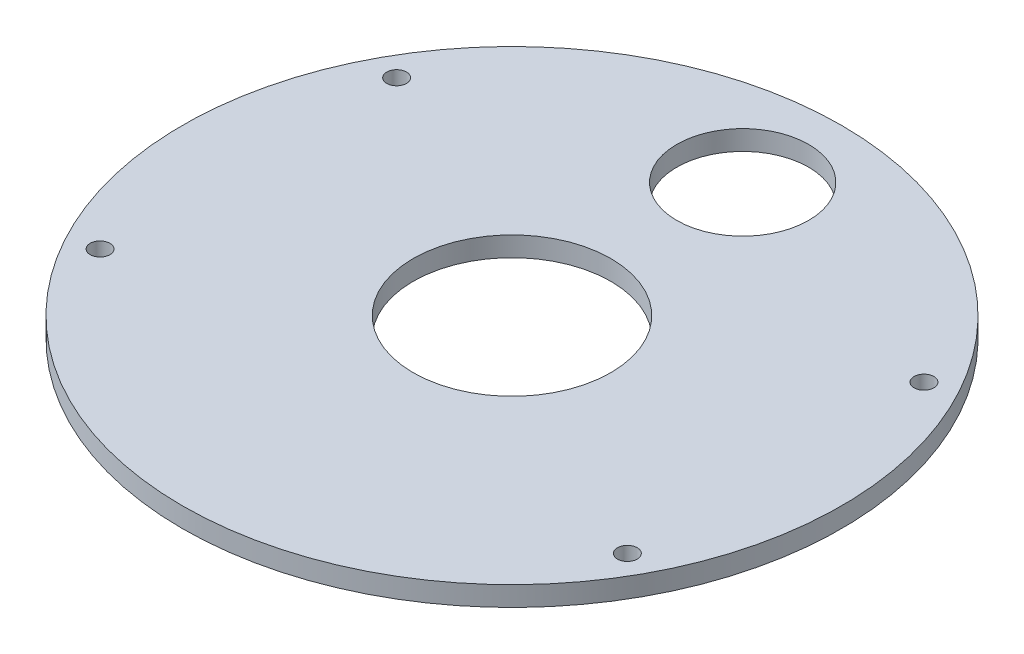
ISO-10303-21;
HEADER;
FILE_DESCRIPTION(('STEP AP214'),'2;1');
FILE_NAME('part.step','',(''),(''),'','','');
FILE_SCHEMA(('AUTOMOTIVE_DESIGN { 1 0 10303 214 1 1 1 1 }'));
ENDSEC;
DATA;
#1=APPLICATION_CONTEXT('core data for automotive mechanical design processes');
#2=APPLICATION_PROTOCOL_DEFINITION('international standard','automotive_design',2000,#1);
#3=PRODUCT_CONTEXT('',#1,'mechanical');
#4=PRODUCT('Part','Part','',(#3));
#5=PRODUCT_RELATED_PRODUCT_CATEGORY('part','',(#4));
#6=PRODUCT_DEFINITION_FORMATION('','',#4);
#7=PRODUCT_DEFINITION_CONTEXT('part definition',#1,'design');
#8=PRODUCT_DEFINITION('design','',#6,#7);
#9=PRODUCT_DEFINITION_SHAPE('','',#8);
#10=(LENGTH_UNIT() NAMED_UNIT(*) SI_UNIT(.MILLI.,.METRE.));
#11=(NAMED_UNIT(*) PLANE_ANGLE_UNIT() SI_UNIT($,.RADIAN.));
#12=(NAMED_UNIT(*) SI_UNIT($,.STERADIAN.) SOLID_ANGLE_UNIT());
#13=UNCERTAINTY_MEASURE_WITH_UNIT(LENGTH_MEASURE(1.E-05),#10,'distance_accuracy_value','');
#14=(GEOMETRIC_REPRESENTATION_CONTEXT(3) GLOBAL_UNCERTAINTY_ASSIGNED_CONTEXT((#13)) GLOBAL_UNIT_ASSIGNED_CONTEXT((#10,
#11,#12)) REPRESENTATION_CONTEXT('',''));
#15=CARTESIAN_POINT('',(0.,0.,0.));
#16=DIRECTION('',(0.,0.,1.));
#17=DIRECTION('',(1.,0.,0.));
#18=AXIS2_PLACEMENT_3D('',#15,#16,#17);
#19=CARTESIAN_POINT('',(0.,3.,0.));
#20=DIRECTION('',(0.,1.,0.));
#21=DIRECTION('',(0.,0.,1.));
#22=AXIS2_PLACEMENT_3D('',#19,#20,#21);
#23=PLANE('',#22);
#24=CARTESIAN_POINT('',(0.,3.,-35.));
#25=DIRECTION('',(0.,1.,0.));
#26=DIRECTION('',(0.,0.,1.));
#27=AXIS2_PLACEMENT_3D('',#24,#25,#26);
#28=CIRCLE('',#27,10.);
#29=CARTESIAN_POINT('',(0.,3.,-25.));
#30=VERTEX_POINT('',#29);
#31=EDGE_CURVE('E76',#30,#30,#28,.T.);
#32=ORIENTED_EDGE('',*,*,#31,.F.);
#33=EDGE_LOOP('',(#32));
#34=FACE_BOUND('',#33,.T.);
#35=CARTESIAN_POINT('',(0.,3.,0.));
#36=DIRECTION('',(0.,1.,0.));
#37=DIRECTION('',(0.,0.,1.));
#38=AXIS2_PLACEMENT_3D('',#35,#36,#37);
#39=CIRCLE('',#38,15.);
#40=CARTESIAN_POINT('',(0.,3.,15.));
#41=VERTEX_POINT('',#40);
#42=EDGE_CURVE('E73',#41,#41,#39,.T.);
#43=ORIENTED_EDGE('',*,*,#42,.F.);
#44=EDGE_LOOP('',(#43));
#45=FACE_BOUND('',#44,.T.);
#46=CARTESIAN_POINT('',(40.,3.,22.5));
#47=DIRECTION('',(0.,1.,0.));
#48=DIRECTION('',(0.,0.,1.));
#49=AXIS2_PLACEMENT_3D('',#46,#47,#48);
#50=CIRCLE('',#49,1.5);
#51=CARTESIAN_POINT('',(40.,3.,24.));
#52=VERTEX_POINT('',#51);
#53=EDGE_CURVE('E59',#52,#52,#50,.T.);
#54=ORIENTED_EDGE('',*,*,#53,.F.);
#55=EDGE_LOOP('',(#54));
#56=FACE_BOUND('',#55,.T.);
#57=CARTESIAN_POINT('',(-40.,3.,-22.5));
#58=DIRECTION('',(0.,1.,0.));
#59=DIRECTION('',(0.,0.,1.));
#60=AXIS2_PLACEMENT_3D('',#57,#58,#59);
#61=CIRCLE('',#60,1.5);
#62=CARTESIAN_POINT('',(-40.,3.,-21.));
#63=VERTEX_POINT('',#62);
#64=EDGE_CURVE('E48',#63,#63,#61,.T.);
#65=ORIENTED_EDGE('',*,*,#64,.F.);
#66=EDGE_LOOP('',(#65));
#67=FACE_BOUND('',#66,.T.);
#68=CARTESIAN_POINT('',(0.,3.,0.));
#69=DIRECTION('',(0.,1.,0.));
#70=DIRECTION('',(0.,0.,1.));
#71=AXIS2_PLACEMENT_3D('',#68,#69,#70);
#72=CIRCLE('',#71,50.);
#73=CARTESIAN_POINT('',(0.,3.,50.));
#74=VERTEX_POINT('',#73);
#75=EDGE_CURVE('E10',#74,#74,#72,.T.);
#76=ORIENTED_EDGE('',*,*,#75,.T.);
#77=EDGE_LOOP('',(#76));
#78=FACE_BOUND('',#77,.T.);
#79=CARTESIAN_POINT('',(40.,3.,-22.5));
#80=DIRECTION('',(0.,1.,0.));
#81=DIRECTION('',(0.,0.,1.));
#82=AXIS2_PLACEMENT_3D('',#79,#80,#81);
#83=CIRCLE('',#82,1.5);
#84=CARTESIAN_POINT('',(40.,3.,-21.));
#85=VERTEX_POINT('',#84);
#86=EDGE_CURVE('E53',#85,#85,#83,.T.);
#87=ORIENTED_EDGE('',*,*,#86,.F.);
#88=EDGE_LOOP('',(#87));
#89=FACE_BOUND('',#88,.T.);
#90=CARTESIAN_POINT('',(-40.,3.,22.5));
#91=DIRECTION('',(0.,1.,0.));
#92=DIRECTION('',(0.,0.,1.));
#93=AXIS2_PLACEMENT_3D('',#90,#91,#92);
#94=CIRCLE('',#93,1.5);
#95=CARTESIAN_POINT('',(-40.,3.,24.));
#96=VERTEX_POINT('',#95);
#97=EDGE_CURVE('E65',#96,#96,#94,.T.);
#98=ORIENTED_EDGE('',*,*,#97,.F.);
#99=EDGE_LOOP('',(#98));
#100=FACE_BOUND('',#99,.T.);
#101=ADVANCED_FACE('F35',(#34,#45,#56,#67,#78,#89,#100),#23,.T.);
#102=CARTESIAN_POINT('',(0.,0.,0.));
#103=DIRECTION('',(0.,1.,0.));
#104=DIRECTION('',(0.,0.,1.));
#105=AXIS2_PLACEMENT_3D('',#102,#103,#104);
#106=PLANE('',#105);
#107=CARTESIAN_POINT('',(0.,0.,-35.));
#108=DIRECTION('',(0.,-1.,0.));
#109=DIRECTION('',(0.,0.,-1.));
#110=AXIS2_PLACEMENT_3D('',#107,#108,#109);
#111=CIRCLE('',#110,10.);
#112=CARTESIAN_POINT('',(0.,0.,-45.));
#113=VERTEX_POINT('',#112);
#114=EDGE_CURVE('E79',#113,#113,#111,.T.);
#115=ORIENTED_EDGE('',*,*,#114,.F.);
#116=EDGE_LOOP('',(#115));
#117=FACE_BOUND('',#116,.T.);
#118=CARTESIAN_POINT('',(0.,0.,0.));
#119=DIRECTION('',(0.,1.,0.));
#120=DIRECTION('',(0.,0.,1.));
#121=AXIS2_PLACEMENT_3D('',#118,#119,#120);
#122=CIRCLE('',#121,15.);
#123=CARTESIAN_POINT('',(0.,0.,15.));
#124=VERTEX_POINT('',#123);
#125=EDGE_CURVE('E39',#124,#124,#122,.T.);
#126=ORIENTED_EDGE('',*,*,#125,.T.);
#127=EDGE_LOOP('',(#126));
#128=FACE_BOUND('',#127,.T.);
#129=CARTESIAN_POINT('',(0.,0.,0.));
#130=DIRECTION('',(0.,1.,0.));
#131=DIRECTION('',(0.,0.,1.));
#132=AXIS2_PLACEMENT_3D('',#129,#130,#131);
#133=CIRCLE('',#132,50.);
#134=CARTESIAN_POINT('',(0.,0.,50.));
#135=VERTEX_POINT('',#134);
#136=EDGE_CURVE('E43',#135,#135,#133,.T.);
#137=ORIENTED_EDGE('',*,*,#136,.F.);
#138=EDGE_LOOP('',(#137));
#139=FACE_BOUND('',#138,.T.);
#140=CARTESIAN_POINT('',(-40.,0.,-22.5));
#141=DIRECTION('',(0.,1.,0.));
#142=DIRECTION('',(0.,0.,1.));
#143=AXIS2_PLACEMENT_3D('',#140,#141,#142);
#144=CIRCLE('',#143,1.5);
#145=CARTESIAN_POINT('',(-40.,0.,-21.));
#146=VERTEX_POINT('',#145);
#147=EDGE_CURVE('E50',#146,#146,#144,.T.);
#148=ORIENTED_EDGE('',*,*,#147,.T.);
#149=EDGE_LOOP('',(#148));
#150=FACE_BOUND('',#149,.T.);
#151=CARTESIAN_POINT('',(40.,0.,-22.5));
#152=DIRECTION('',(0.,1.,0.));
#153=DIRECTION('',(0.,0.,1.));
#154=AXIS2_PLACEMENT_3D('',#151,#152,#153);
#155=CIRCLE('',#154,1.5);
#156=CARTESIAN_POINT('',(40.,0.,-21.));
#157=VERTEX_POINT('',#156);
#158=EDGE_CURVE('E56',#157,#157,#155,.T.);
#159=ORIENTED_EDGE('',*,*,#158,.T.);
#160=EDGE_LOOP('',(#159));
#161=FACE_BOUND('',#160,.T.);
#162=CARTESIAN_POINT('',(40.,0.,22.5));
#163=DIRECTION('',(0.,1.,0.));
#164=DIRECTION('',(0.,0.,1.));
#165=AXIS2_PLACEMENT_3D('',#162,#163,#164);
#166=CIRCLE('',#165,1.5);
#167=CARTESIAN_POINT('',(40.,0.,24.));
#168=VERTEX_POINT('',#167);
#169=EDGE_CURVE('E62',#168,#168,#166,.T.);
#170=ORIENTED_EDGE('',*,*,#169,.T.);
#171=EDGE_LOOP('',(#170));
#172=FACE_BOUND('',#171,.T.);
#173=CARTESIAN_POINT('',(-40.,0.,22.5));
#174=DIRECTION('',(0.,1.,0.));
#175=DIRECTION('',(0.,0.,1.));
#176=AXIS2_PLACEMENT_3D('',#173,#174,#175);
#177=CIRCLE('',#176,1.5);
#178=CARTESIAN_POINT('',(-40.,0.,24.));
#179=VERTEX_POINT('',#178);
#180=EDGE_CURVE('E68',#179,#179,#177,.T.);
#181=ORIENTED_EDGE('',*,*,#180,.T.);
#182=EDGE_LOOP('',(#181));
#183=FACE_BOUND('',#182,.T.);
#184=ADVANCED_FACE('F85',(#117,#128,#139,#150,#161,#172,#183),#106,.F.);
#185=CARTESIAN_POINT('',(0.,3.,0.));
#186=DIRECTION('',(0.,-1.,0.));
#187=DIRECTION('',(0.,0.,-1.));
#188=AXIS2_PLACEMENT_3D('',#185,#186,#187);
#189=CYLINDRICAL_SURFACE('',#188,50.);
#190=ORIENTED_EDGE('',*,*,#75,.F.);
#191=EDGE_LOOP('',(#190));
#192=FACE_BOUND('',#191,.T.);
#193=ORIENTED_EDGE('',*,*,#136,.T.);
#194=EDGE_LOOP('',(#193));
#195=FACE_BOUND('',#194,.T.);
#196=ADVANCED_FACE('F37',(#192,#195),#189,.T.);
#197=CARTESIAN_POINT('',(-40.,3.,-22.5));
#198=DIRECTION('',(0.,-1.,0.));
#199=DIRECTION('',(0.,0.,-1.));
#200=AXIS2_PLACEMENT_3D('',#197,#198,#199);
#201=CYLINDRICAL_SURFACE('',#200,1.5);
#202=ORIENTED_EDGE('',*,*,#64,.T.);
#203=EDGE_LOOP('',(#202));
#204=FACE_BOUND('',#203,.T.);
#205=ORIENTED_EDGE('',*,*,#147,.F.);
#206=EDGE_LOOP('',(#205));
#207=FACE_BOUND('',#206,.T.);
#208=ADVANCED_FACE('F124',(#204,#207),#201,.F.);
#209=CARTESIAN_POINT('',(40.,3.,-22.5));
#210=DIRECTION('',(0.,-1.,0.));
#211=DIRECTION('',(0.,0.,-1.));
#212=AXIS2_PLACEMENT_3D('',#209,#210,#211);
#213=CYLINDRICAL_SURFACE('',#212,1.5);
#214=ORIENTED_EDGE('',*,*,#86,.T.);
#215=EDGE_LOOP('',(#214));
#216=FACE_BOUND('',#215,.T.);
#217=ORIENTED_EDGE('',*,*,#158,.F.);
#218=EDGE_LOOP('',(#217));
#219=FACE_BOUND('',#218,.T.);
#220=ADVANCED_FACE('F113',(#216,#219),#213,.F.);
#221=CARTESIAN_POINT('',(40.,3.,22.5));
#222=DIRECTION('',(0.,-1.,0.));
#223=DIRECTION('',(0.,0.,-1.));
#224=AXIS2_PLACEMENT_3D('',#221,#222,#223);
#225=CYLINDRICAL_SURFACE('',#224,1.5);
#226=ORIENTED_EDGE('',*,*,#53,.T.);
#227=EDGE_LOOP('',(#226));
#228=FACE_BOUND('',#227,.T.);
#229=ORIENTED_EDGE('',*,*,#169,.F.);
#230=EDGE_LOOP('',(#229));
#231=FACE_BOUND('',#230,.T.);
#232=ADVANCED_FACE('F104',(#228,#231),#225,.F.);
#233=CARTESIAN_POINT('',(-40.,3.,22.5));
#234=DIRECTION('',(0.,-1.,0.));
#235=DIRECTION('',(0.,0.,-1.));
#236=AXIS2_PLACEMENT_3D('',#233,#234,#235);
#237=CYLINDRICAL_SURFACE('',#236,1.5);
#238=ORIENTED_EDGE('',*,*,#97,.T.);
#239=EDGE_LOOP('',(#238));
#240=FACE_BOUND('',#239,.T.);
#241=ORIENTED_EDGE('',*,*,#180,.F.);
#242=EDGE_LOOP('',(#241));
#243=FACE_BOUND('',#242,.T.);
#244=ADVANCED_FACE('F101',(#240,#243),#237,.F.);
#245=CARTESIAN_POINT('',(0.,-7.,0.));
#246=DIRECTION('',(0.,1.,0.));
#247=DIRECTION('',(0.,0.,1.));
#248=AXIS2_PLACEMENT_3D('',#245,#246,#247);
#249=CYLINDRICAL_SURFACE('',#248,15.);
#250=ORIENTED_EDGE('',*,*,#42,.T.);
#251=EDGE_LOOP('',(#250));
#252=FACE_BOUND('',#251,.T.);
#253=ORIENTED_EDGE('',*,*,#125,.F.);
#254=EDGE_LOOP('',(#253));
#255=FACE_BOUND('',#254,.T.);
#256=ADVANCED_FACE('F103',(#252,#255),#249,.F.);
#257=CARTESIAN_POINT('',(0.,10.,-35.));
#258=DIRECTION('',(0.,-1.,0.));
#259=DIRECTION('',(0.,0.,-1.));
#260=AXIS2_PLACEMENT_3D('',#257,#258,#259);
#261=CYLINDRICAL_SURFACE('',#260,10.);
#262=ORIENTED_EDGE('',*,*,#31,.T.);
#263=EDGE_LOOP('',(#262));
#264=FACE_BOUND('',#263,.T.);
#265=ORIENTED_EDGE('',*,*,#114,.T.);
#266=EDGE_LOOP('',(#265));
#267=FACE_BOUND('',#266,.T.);
#268=ADVANCED_FACE('F83',(#264,#267),#261,.F.);
#269=CLOSED_SHELL('',(#101,#184,#196,#208,#220,#232,#244,#256,#268));
#270=MANIFOLD_SOLID_BREP('B2',#269);
#271=ADVANCED_BREP_SHAPE_REPRESENTATION('',(#18,#270),#14);
#272=SHAPE_DEFINITION_REPRESENTATION(#9,#271);
ENDSEC;
END-ISO-10303-21;
